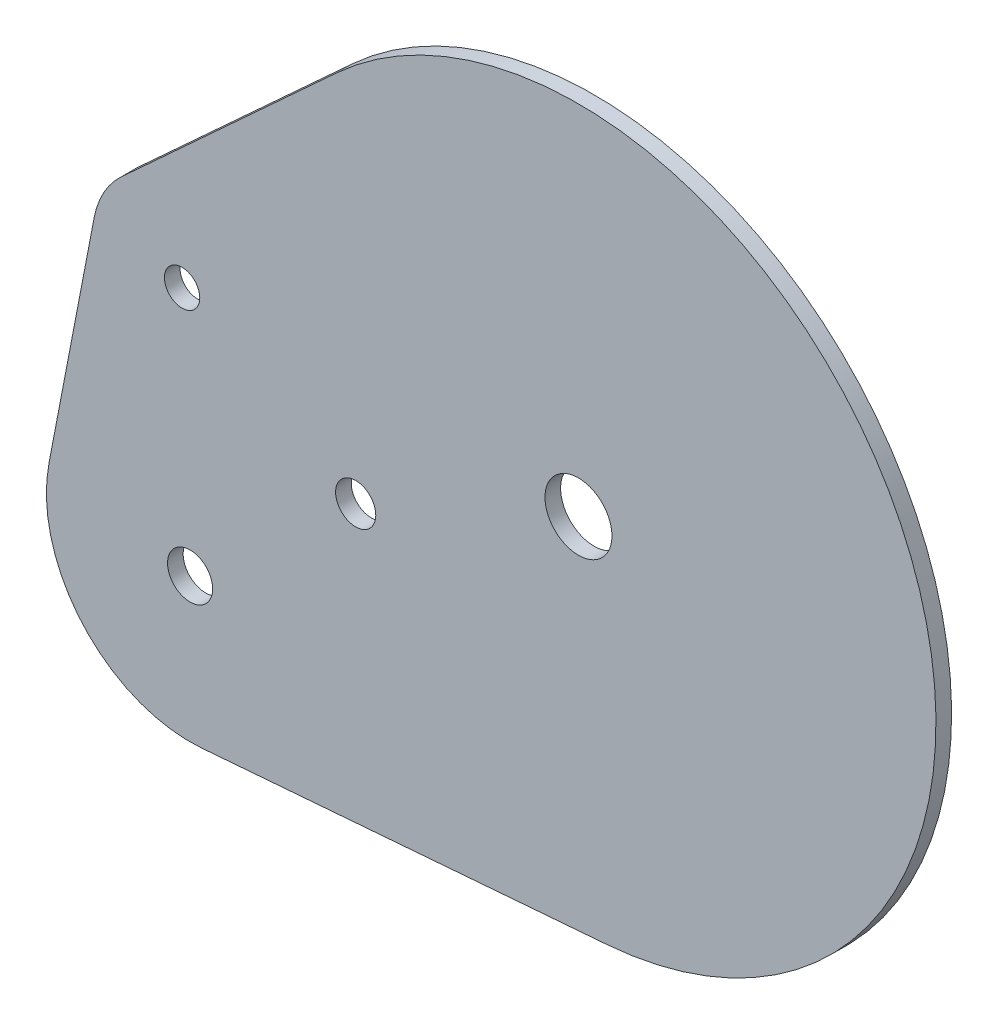
ISO-10303-21;
HEADER;
FILE_DESCRIPTION(('STEP AP214'),'2;1');
FILE_NAME('part.step','',(''),(''),'','','');
FILE_SCHEMA(('AUTOMOTIVE_DESIGN { 1 0 10303 214 1 1 1 1 }'));
ENDSEC;
DATA;
#1=APPLICATION_CONTEXT('core data for automotive mechanical design processes');
#2=APPLICATION_PROTOCOL_DEFINITION('international standard','automotive_design',2000,#1);
#3=PRODUCT_CONTEXT('',#1,'mechanical');
#4=PRODUCT('Part','Part','',(#3));
#5=PRODUCT_RELATED_PRODUCT_CATEGORY('part','',(#4));
#6=PRODUCT_DEFINITION_FORMATION('','',#4);
#7=PRODUCT_DEFINITION_CONTEXT('part definition',#1,'design');
#8=PRODUCT_DEFINITION('design','',#6,#7);
#9=PRODUCT_DEFINITION_SHAPE('','',#8);
#10=(LENGTH_UNIT() NAMED_UNIT(*) SI_UNIT(.MILLI.,.METRE.));
#11=(NAMED_UNIT(*) PLANE_ANGLE_UNIT() SI_UNIT($,.RADIAN.));
#12=(NAMED_UNIT(*) SI_UNIT($,.STERADIAN.) SOLID_ANGLE_UNIT());
#13=UNCERTAINTY_MEASURE_WITH_UNIT(LENGTH_MEASURE(1.E-05),#10,'distance_accuracy_value','');
#14=(GEOMETRIC_REPRESENTATION_CONTEXT(3) GLOBAL_UNCERTAINTY_ASSIGNED_CONTEXT((#13)) GLOBAL_UNIT_ASSIGNED_CONTEXT((#10,
#11,#12)) REPRESENTATION_CONTEXT('',''));
#15=CARTESIAN_POINT('',(0.,0.,0.));
#16=DIRECTION('',(0.,0.,1.));
#17=DIRECTION('',(1.,0.,0.));
#18=AXIS2_PLACEMENT_3D('',#15,#16,#17);
#19=CARTESIAN_POINT('',(-1.60982338570648E-12,1.8327353523695E-12,4.445));
#20=DIRECTION('',(0.,0.,-1.));
#21=DIRECTION('',(-1.,0.,0.));
#22=AXIS2_PLACEMENT_3D('',#19,#20,#21);
#23=CYLINDRICAL_SURFACE('',#22,25.4524678909989);
#24=DIRECTION('',(0.,0.,-1.));
#25=VECTOR('',#24,1.);
#26=CARTESIAN_POINT('',(-24.9953882674721,4.8019461784516,201.32048336804));
#27=LINE('',#26,#25);
#28=CARTESIAN_POINT('',(-24.9953882674721,4.8019461784516,4.445));
#29=VERTEX_POINT('',#28);
#30=CARTESIAN_POINT('',(-24.9953882674721,4.8019461784516,0.));
#31=VERTEX_POINT('',#30);
#32=EDGE_CURVE('E218',#29,#31,#27,.T.);
#33=ORIENTED_EDGE('',*,*,#32,.F.);
#34=CARTESIAN_POINT('',(-1.60982338570648E-12,1.8327353523695E-12,4.445));
#35=DIRECTION('',(0.,0.,1.));
#36=DIRECTION('',(1.,0.,0.));
#37=AXIS2_PLACEMENT_3D('',#34,#35,#36);
#38=CIRCLE('',#37,25.4524678909989);
#39=CARTESIAN_POINT('',(-17.2110159448165,18.7512413426328,4.445));
#40=VERTEX_POINT('',#39);
#41=EDGE_CURVE('E167',#40,#29,#38,.T.);
#42=ORIENTED_EDGE('',*,*,#41,.F.);
#43=DIRECTION('',(0.,0.,-1.));
#44=VECTOR('',#43,1.);
#45=CARTESIAN_POINT('',(-17.2110159448165,18.7512413426328,4.445));
#46=LINE('',#45,#44);
#47=CARTESIAN_POINT('',(-17.2110159448165,18.7512413426328,0.));
#48=VERTEX_POINT('',#47);
#49=EDGE_CURVE('E42',#40,#48,#46,.T.);
#50=ORIENTED_EDGE('',*,*,#49,.T.);
#51=CARTESIAN_POINT('',(-1.60982338570648E-12,1.8327353523695E-12,0.));
#52=DIRECTION('',(0.,0.,1.));
#53=DIRECTION('',(1.,0.,0.));
#54=AXIS2_PLACEMENT_3D('',#51,#52,#53);
#55=CIRCLE('',#54,25.4524678909989);
#56=EDGE_CURVE('E172',#48,#31,#55,.T.);
#57=ORIENTED_EDGE('',*,*,#56,.T.);
#58=EDGE_LOOP('',(#33,#42,#50,#57));
#59=FACE_BOUND('',#58,.T.);
#60=ADVANCED_FACE('F35',(#59),#23,.T.);
#61=CARTESIAN_POINT('',(-1.60982338570648E-12,1.8327353523695E-12,4.445));
#62=DIRECTION('',(0.,0.,1.));
#63=DIRECTION('',(1.,0.,0.));
#64=AXIS2_PLACEMENT_3D('',#61,#62,#63);
#65=PLANE('',#64);
#66=ORIENTED_EDGE('',*,*,#41,.T.);
#67=DIRECTION('',(-0.188663284009011,-0.982041834784514,0.));
#68=VECTOR('',#67,1.);
#69=CARTESIAN_POINT('',(-24.9953882674721,4.8019461784516,4.445));
#70=LINE('',#69,#68);
#71=CARTESIAN_POINT('',(-37.8559058277664,-62.1404179785651,4.445));
#72=VERTEX_POINT('',#71);
#73=EDGE_CURVE('E207',#29,#72,#70,.T.);
#74=ORIENTED_EDGE('',*,*,#73,.T.);
#75=CARTESIAN_POINT('',(2.27448898392381,-69.85,4.445));
#76=DIRECTION('',(0.,0.,1.));
#77=DIRECTION('',(1.,0.,0.));
#78=AXIS2_PLACEMENT_3D('',#75,#76,#77);
#79=CIRCLE('',#78,40.864241614);
#80=CARTESIAN_POINT('',(5.53884195385694,-110.583650000645,4.445));
#81=VERTEX_POINT('',#80);
#82=EDGE_CURVE('E152',#72,#81,#79,.T.);
#83=ORIENTED_EDGE('',*,*,#82,.T.);
#84=DIRECTION('',(0.996804257017947,0.0798828716991234,0.));
#85=VECTOR('',#84,1.);
#86=CARTESIAN_POINT('',(5.53884195385696,-110.583650000645,4.445));
#87=LINE('',#86,#85);
#88=CARTESIAN_POINT('',(120.83410477307,-101.344005785183,4.445));
#89=VERTEX_POINT('',#88);
#90=EDGE_CURVE('E57',#81,#89,#87,.T.);
#91=ORIENTED_EDGE('',*,*,#90,.T.);
#92=CARTESIAN_POINT('',(112.7125,0.,4.445));
#93=DIRECTION('',(0.,0.,1.));
#94=DIRECTION('',(1.,0.,0.));
#95=AXIS2_PLACEMENT_3D('',#92,#93,#94);
#96=CIRCLE('',#95,101.668913502);
#97=CARTESIAN_POINT('',(43.9637523787988,74.901119305345,4.445));
#98=VERTEX_POINT('',#97);
#99=EDGE_CURVE('E163',#89,#98,#96,.T.);
#100=ORIENTED_EDGE('',*,*,#99,.T.);
#101=DIRECTION('',(-0.736716039597213,-0.676202245633803,0.));
#102=VECTOR('',#101,1.);
#103=CARTESIAN_POINT('',(-17.2110159448165,18.7512413426328,4.445));
#104=LINE('',#103,#102);
#105=EDGE_CURVE('E166',#98,#40,#104,.T.);
#106=ORIENTED_EDGE('',*,*,#105,.T.);
#107=EDGE_LOOP('',(#66,#74,#83,#91,#100,#106));
#108=FACE_BOUND('',#107,.T.);
#109=CARTESIAN_POINT('',(112.7125,0.,4.445));
#110=DIRECTION('',(0.,0.,1.));
#111=DIRECTION('',(1.,0.,0.));
#112=AXIS2_PLACEMENT_3D('',#109,#110,#111);
#113=CIRCLE('',#112,9.52500000000001);
#114=CARTESIAN_POINT('',(122.2375,0.,4.445));
#115=VERTEX_POINT('',#114);
#116=EDGE_CURVE('E236',#115,#115,#113,.T.);
#117=ORIENTED_EDGE('',*,*,#116,.F.);
#118=EDGE_LOOP('',(#117));
#119=FACE_BOUND('',#118,.T.);
#120=CARTESIAN_POINT('',(-1.60982338570648E-12,1.8327353523695E-12,4.445));
#121=DIRECTION('',(0.,0.,1.));
#122=DIRECTION('',(1.,0.,0.));
#123=AXIS2_PLACEMENT_3D('',#120,#121,#122);
#124=CIRCLE('',#123,5.02539999999999);
#125=CARTESIAN_POINT('',(5.02539999999838,1.8327353523695E-12,4.445));
#126=VERTEX_POINT('',#125);
#127=EDGE_CURVE('E176',#126,#126,#124,.T.);
#128=ORIENTED_EDGE('',*,*,#127,.F.);
#129=EDGE_LOOP('',(#128));
#130=FACE_BOUND('',#129,.T.);
#131=CARTESIAN_POINT('',(49.3634480157114,-28.4999999999982,4.445));
#132=DIRECTION('',(0.,0.,1.));
#133=DIRECTION('',(1.,0.,0.));
#134=AXIS2_PLACEMENT_3D('',#131,#132,#133);
#135=CIRCLE('',#134,5.715);
#136=CARTESIAN_POINT('',(55.0784480157114,-28.4999999999982,4.445));
#137=VERTEX_POINT('',#136);
#138=EDGE_CURVE('E223',#137,#137,#135,.T.);
#139=ORIENTED_EDGE('',*,*,#138,.F.);
#140=EDGE_LOOP('',(#139));
#141=FACE_BOUND('',#140,.T.);
#142=CARTESIAN_POINT('',(2.27448898392381,-69.85,4.445));
#143=DIRECTION('',(0.,0.,1.));
#144=DIRECTION('',(1.,0.,0.));
#145=AXIS2_PLACEMENT_3D('',#142,#143,#144);
#146=CIRCLE('',#145,6.41350000000001);
#147=CARTESIAN_POINT('',(8.68798898392382,-69.85,4.445));
#148=VERTEX_POINT('',#147);
#149=EDGE_CURVE('E146',#148,#148,#146,.T.);
#150=ORIENTED_EDGE('',*,*,#149,.F.);
#151=EDGE_LOOP('',(#150));
#152=FACE_BOUND('',#151,.T.);
#153=ADVANCED_FACE('F262',(#108,#119,#130,#141,#152),#65,.T.);
#154=CARTESIAN_POINT('',(-1.60982338570648E-12,1.8327353523695E-12,0.));
#155=DIRECTION('',(0.,0.,1.));
#156=DIRECTION('',(1.,0.,0.));
#157=AXIS2_PLACEMENT_3D('',#154,#155,#156);
#158=PLANE('',#157);
#159=DIRECTION('',(-1.,0.,0.));
#160=VECTOR('',#159,1.);
#161=CARTESIAN_POINT('',(102.007029071081,43.889088001976,0.));
#162=LINE('',#161,#160);
#163=CARTESIAN_POINT('',(102.007029071081,43.889088001976,0.));
#164=VERTEX_POINT('',#163);
#165=CARTESIAN_POINT('',(88.5040973105047,43.889088001976,0.));
#166=VERTEX_POINT('',#165);
#167=EDGE_CURVE('E140',#164,#166,#162,.T.);
#168=ORIENTED_EDGE('',*,*,#167,.F.);
#169=DIRECTION('',(0.,-1.,0.));
#170=VECTOR('',#169,1.);
#171=CARTESIAN_POINT('',(102.007029071081,50.1084351119226,0.));
#172=LINE('',#171,#170);
#173=CARTESIAN_POINT('',(102.007029071081,50.1084351119226,0.));
#174=VERTEX_POINT('',#173);
#175=EDGE_CURVE('E49',#174,#164,#172,.T.);
#176=ORIENTED_EDGE('',*,*,#175,.F.);
#177=DIRECTION('',(1.,0.,0.));
#178=VECTOR('',#177,1.);
#179=CARTESIAN_POINT('',(102.007029071081,50.1084351119226,0.));
#180=LINE('',#179,#178);
#181=CARTESIAN_POINT('',(88.5040973105047,50.1084351119226,0.));
#182=VERTEX_POINT('',#181);
#183=EDGE_CURVE('E131',#182,#174,#180,.T.);
#184=ORIENTED_EDGE('',*,*,#183,.F.);
#185=DIRECTION('',(0.,1.,0.));
#186=VECTOR('',#185,1.);
#187=CARTESIAN_POINT('',(88.5040973105047,50.1084351119226,0.));
#188=LINE('',#187,#186);
#189=EDGE_CURVE('E134',#166,#182,#188,.T.);
#190=ORIENTED_EDGE('',*,*,#189,.F.);
#191=EDGE_LOOP('',(#168,#176,#184,#190));
#192=FACE_BOUND('',#191,.T.);
#193=DIRECTION('',(-0.188663284009011,-0.982041834784514,0.));
#194=VECTOR('',#193,1.);
#195=CARTESIAN_POINT('',(-24.9953882674721,4.8019461784516,0.));
#196=LINE('',#195,#194);
#197=CARTESIAN_POINT('',(-37.8559058277664,-62.1404179785651,0.));
#198=VERTEX_POINT('',#197);
#199=EDGE_CURVE('E196',#31,#198,#196,.T.);
#200=ORIENTED_EDGE('',*,*,#199,.F.);
#201=ORIENTED_EDGE('',*,*,#56,.F.);
#202=DIRECTION('',(-0.736716039597213,-0.676202245633803,0.));
#203=VECTOR('',#202,1.);
#204=CARTESIAN_POINT('',(-17.2110159448165,18.7512413426328,0.));
#205=LINE('',#204,#203);
#206=CARTESIAN_POINT('',(43.9637523787988,74.901119305345,0.));
#207=VERTEX_POINT('',#206);
#208=EDGE_CURVE('E178',#207,#48,#205,.T.);
#209=ORIENTED_EDGE('',*,*,#208,.F.);
#210=CARTESIAN_POINT('',(112.7125,0.,0.));
#211=DIRECTION('',(0.,0.,1.));
#212=DIRECTION('',(1.,0.,0.));
#213=AXIS2_PLACEMENT_3D('',#210,#211,#212);
#214=CIRCLE('',#213,101.668913502);
#215=CARTESIAN_POINT('',(120.83410477307,-101.344005785183,0.));
#216=VERTEX_POINT('',#215);
#217=EDGE_CURVE('E175',#216,#207,#214,.T.);
#218=ORIENTED_EDGE('',*,*,#217,.F.);
#219=DIRECTION('',(0.996804257017947,0.0798828716991234,0.));
#220=VECTOR('',#219,1.);
#221=CARTESIAN_POINT('',(5.53884195385696,-110.583650000645,0.));
#222=LINE('',#221,#220);
#223=CARTESIAN_POINT('',(5.53884195385694,-110.583650000645,0.));
#224=VERTEX_POINT('',#223);
#225=EDGE_CURVE('E204',#224,#216,#222,.T.);
#226=ORIENTED_EDGE('',*,*,#225,.F.);
#227=CARTESIAN_POINT('',(2.27448898392381,-69.85,0.));
#228=DIRECTION('',(0.,0.,1.));
#229=DIRECTION('',(1.,0.,0.));
#230=AXIS2_PLACEMENT_3D('',#227,#228,#229);
#231=CIRCLE('',#230,40.864241614);
#232=EDGE_CURVE('E199',#198,#224,#231,.T.);
#233=ORIENTED_EDGE('',*,*,#232,.F.);
#234=EDGE_LOOP('',(#200,#201,#209,#218,#226,#233));
#235=FACE_BOUND('',#234,.T.);
#236=CARTESIAN_POINT('',(112.7125,0.,0.));
#237=DIRECTION('',(0.,0.,1.));
#238=DIRECTION('',(1.,0.,0.));
#239=AXIS2_PLACEMENT_3D('',#236,#237,#238);
#240=CIRCLE('',#239,9.52500000000001);
#241=CARTESIAN_POINT('',(122.2375,0.,0.));
#242=VERTEX_POINT('',#241);
#243=EDGE_CURVE('E227',#242,#242,#240,.T.);
#244=ORIENTED_EDGE('',*,*,#243,.T.);
#245=EDGE_LOOP('',(#244));
#246=FACE_BOUND('',#245,.T.);
#247=CARTESIAN_POINT('',(-1.60982338570648E-12,1.8327353523695E-12,0.));
#248=DIRECTION('',(0.,0.,1.));
#249=DIRECTION('',(1.,0.,0.));
#250=AXIS2_PLACEMENT_3D('',#247,#248,#249);
#251=CIRCLE('',#250,5.02539999999999);
#252=CARTESIAN_POINT('',(5.02539999999838,1.8327353523695E-12,0.));
#253=VERTEX_POINT('',#252);
#254=EDGE_CURVE('E234',#253,#253,#251,.T.);
#255=ORIENTED_EDGE('',*,*,#254,.T.);
#256=EDGE_LOOP('',(#255));
#257=FACE_BOUND('',#256,.T.);
#258=CARTESIAN_POINT('',(49.3634480157114,-28.4999999999982,0.));
#259=DIRECTION('',(0.,0.,1.));
#260=DIRECTION('',(1.,0.,0.));
#261=AXIS2_PLACEMENT_3D('',#258,#259,#260);
#262=CIRCLE('',#261,5.715);
#263=CARTESIAN_POINT('',(55.0784480157114,-28.4999999999982,0.));
#264=VERTEX_POINT('',#263);
#265=EDGE_CURVE('E219',#264,#264,#262,.T.);
#266=ORIENTED_EDGE('',*,*,#265,.T.);
#267=EDGE_LOOP('',(#266));
#268=FACE_BOUND('',#267,.T.);
#269=CARTESIAN_POINT('',(2.27448898392381,-69.85,0.));
#270=DIRECTION('',(0.,0.,1.));
#271=DIRECTION('',(1.,0.,0.));
#272=AXIS2_PLACEMENT_3D('',#269,#270,#271);
#273=CIRCLE('',#272,6.41350000000001);
#274=CARTESIAN_POINT('',(8.68798898392382,-69.85,0.));
#275=VERTEX_POINT('',#274);
#276=EDGE_CURVE('E202',#275,#275,#273,.T.);
#277=ORIENTED_EDGE('',*,*,#276,.T.);
#278=EDGE_LOOP('',(#277));
#279=FACE_BOUND('',#278,.T.);
#280=ADVANCED_FACE('F191',(#192,#235,#246,#257,#268,#279),#158,.F.);
#281=CARTESIAN_POINT('',(112.7125,0.,4.445));
#282=DIRECTION('',(0.,0.,-1.));
#283=DIRECTION('',(-1.,0.,0.));
#284=AXIS2_PLACEMENT_3D('',#281,#282,#283);
#285=CYLINDRICAL_SURFACE('',#284,101.668913502);
#286=ORIENTED_EDGE('',*,*,#99,.F.);
#287=DIRECTION('',(0.,0.,-1.));
#288=VECTOR('',#287,1.);
#289=CARTESIAN_POINT('',(120.83410477307,-101.344005785183,201.32048336804));
#290=LINE('',#289,#288);
#291=EDGE_CURVE('E211',#89,#216,#290,.T.);
#292=ORIENTED_EDGE('',*,*,#291,.T.);
#293=ORIENTED_EDGE('',*,*,#217,.T.);
#294=DIRECTION('',(0.,0.,-1.));
#295=VECTOR('',#294,1.);
#296=CARTESIAN_POINT('',(43.9637523787988,74.901119305345,4.445));
#297=LINE('',#296,#295);
#298=EDGE_CURVE('E12',#98,#207,#297,.T.);
#299=ORIENTED_EDGE('',*,*,#298,.F.);
#300=EDGE_LOOP('',(#286,#292,#293,#299));
#301=FACE_BOUND('',#300,.T.);
#302=ADVANCED_FACE('F270',(#301),#285,.T.);
#303=CARTESIAN_POINT('',(-17.2110159448165,18.7512413426328,4.445));
#304=DIRECTION('',(0.676202245633803,-0.736716039597213,0.));
#305=DIRECTION('',(0.736716039597213,0.676202245633803,0.));
#306=AXIS2_PLACEMENT_3D('',#303,#304,#305);
#307=PLANE('',#306);
#308=ORIENTED_EDGE('',*,*,#208,.T.);
#309=ORIENTED_EDGE('',*,*,#49,.F.);
#310=ORIENTED_EDGE('',*,*,#105,.F.);
#311=ORIENTED_EDGE('',*,*,#298,.T.);
#312=EDGE_LOOP('',(#308,#309,#310,#311));
#313=FACE_BOUND('',#312,.T.);
#314=ADVANCED_FACE('F258',(#313),#307,.F.);
#315=CARTESIAN_POINT('',(-1.60982338570648E-12,1.8327353523695E-12,4.445));
#316=DIRECTION('',(0.,0.,-1.));
#317=DIRECTION('',(-1.,0.,0.));
#318=AXIS2_PLACEMENT_3D('',#315,#316,#317);
#319=CYLINDRICAL_SURFACE('',#318,5.02539999999999);
#320=ORIENTED_EDGE('',*,*,#127,.T.);
#321=EDGE_LOOP('',(#320));
#322=FACE_BOUND('',#321,.T.);
#323=ORIENTED_EDGE('',*,*,#254,.F.);
#324=EDGE_LOOP('',(#323));
#325=FACE_BOUND('',#324,.T.);
#326=ADVANCED_FACE('F249',(#322,#325),#319,.F.);
#327=CARTESIAN_POINT('',(112.7125,0.,4.445));
#328=DIRECTION('',(0.,0.,-1.));
#329=DIRECTION('',(-1.,0.,0.));
#330=AXIS2_PLACEMENT_3D('',#327,#328,#329);
#331=CYLINDRICAL_SURFACE('',#330,9.52500000000001);
#332=ORIENTED_EDGE('',*,*,#116,.T.);
#333=EDGE_LOOP('',(#332));
#334=FACE_BOUND('',#333,.T.);
#335=ORIENTED_EDGE('',*,*,#243,.F.);
#336=EDGE_LOOP('',(#335));
#337=FACE_BOUND('',#336,.T.);
#338=ADVANCED_FACE('F246',(#334,#337),#331,.F.);
#339=CARTESIAN_POINT('',(49.3634480157114,-28.4999999999982,4.445));
#340=DIRECTION('',(0.,0.,-1.));
#341=DIRECTION('',(-1.,0.,0.));
#342=AXIS2_PLACEMENT_3D('',#339,#340,#341);
#343=CYLINDRICAL_SURFACE('',#342,5.715);
#344=ORIENTED_EDGE('',*,*,#138,.T.);
#345=EDGE_LOOP('',(#344));
#346=FACE_BOUND('',#345,.T.);
#347=ORIENTED_EDGE('',*,*,#265,.F.);
#348=EDGE_LOOP('',(#347));
#349=FACE_BOUND('',#348,.T.);
#350=ADVANCED_FACE('F248',(#346,#349),#343,.F.);
#351=CARTESIAN_POINT('',(5.53884195385696,-110.583650000645,201.32048336804));
#352=DIRECTION('',(-0.0798828716991234,0.996804257017947,0.));
#353=DIRECTION('',(-0.996804257017947,-0.0798828716991234,0.));
#354=AXIS2_PLACEMENT_3D('',#351,#352,#353);
#355=PLANE('',#354);
#356=ORIENTED_EDGE('',*,*,#90,.F.);
#357=DIRECTION('',(0.,0.,-1.));
#358=VECTOR('',#357,1.);
#359=CARTESIAN_POINT('',(5.53884195385694,-110.583650000645,201.32048336804));
#360=LINE('',#359,#358);
#361=EDGE_CURVE('E214',#81,#224,#360,.T.);
#362=ORIENTED_EDGE('',*,*,#361,.T.);
#363=ORIENTED_EDGE('',*,*,#225,.T.);
#364=ORIENTED_EDGE('',*,*,#291,.F.);
#365=EDGE_LOOP('',(#356,#362,#363,#364));
#366=FACE_BOUND('',#365,.T.);
#367=ADVANCED_FACE('F255',(#366),#355,.F.);
#368=CARTESIAN_POINT('',(2.27448898392381,-69.85,201.32048336804));
#369=DIRECTION('',(0.,0.,-1.));
#370=DIRECTION('',(-1.,0.,0.));
#371=AXIS2_PLACEMENT_3D('',#368,#369,#370);
#372=CYLINDRICAL_SURFACE('',#371,40.864241614);
#373=ORIENTED_EDGE('',*,*,#82,.F.);
#374=DIRECTION('',(0.,0.,-1.));
#375=VECTOR('',#374,1.);
#376=CARTESIAN_POINT('',(-37.8559058277664,-62.1404179785651,201.32048336804));
#377=LINE('',#376,#375);
#378=EDGE_CURVE('E216',#72,#198,#377,.T.);
#379=ORIENTED_EDGE('',*,*,#378,.T.);
#380=ORIENTED_EDGE('',*,*,#232,.T.);
#381=ORIENTED_EDGE('',*,*,#361,.F.);
#382=EDGE_LOOP('',(#373,#379,#380,#381));
#383=FACE_BOUND('',#382,.T.);
#384=ADVANCED_FACE('F287',(#383),#372,.T.);
#385=CARTESIAN_POINT('',(-24.9953882674721,4.8019461784516,201.32048336804));
#386=DIRECTION('',(0.982041834784514,-0.188663284009011,0.));
#387=DIRECTION('',(0.188663284009011,0.982041834784514,0.));
#388=AXIS2_PLACEMENT_3D('',#385,#386,#387);
#389=PLANE('',#388);
#390=ORIENTED_EDGE('',*,*,#73,.F.);
#391=ORIENTED_EDGE('',*,*,#32,.T.);
#392=ORIENTED_EDGE('',*,*,#199,.T.);
#393=ORIENTED_EDGE('',*,*,#378,.F.);
#394=EDGE_LOOP('',(#390,#391,#392,#393));
#395=FACE_BOUND('',#394,.T.);
#396=ADVANCED_FACE('F285',(#395),#389,.F.);
#397=CARTESIAN_POINT('',(2.27448898392381,-69.85,201.32048336804));
#398=DIRECTION('',(0.,0.,-1.));
#399=DIRECTION('',(-1.,0.,0.));
#400=AXIS2_PLACEMENT_3D('',#397,#398,#399);
#401=CYLINDRICAL_SURFACE('',#400,6.41350000000001);
#402=ORIENTED_EDGE('',*,*,#276,.F.);
#403=EDGE_LOOP('',(#402));
#404=FACE_BOUND('',#403,.T.);
#405=ORIENTED_EDGE('',*,*,#149,.T.);
#406=EDGE_LOOP('',(#405));
#407=FACE_BOUND('',#406,.T.);
#408=ADVANCED_FACE('F297',(#404,#407),#401,.F.);
#409=CARTESIAN_POINT('',(102.007029071081,50.1084351119226,2.54));
#410=DIRECTION('',(1.,0.,0.));
#411=DIRECTION('',(0.,0.,-1.));
#412=AXIS2_PLACEMENT_3D('',#409,#410,#411);
#413=PLANE('',#412);
#414=ORIENTED_EDGE('',*,*,#175,.T.);
#415=DIRECTION('',(0.,0.,-1.));
#416=VECTOR('',#415,1.);
#417=CARTESIAN_POINT('',(102.007029071081,43.889088001976,2.54));
#418=LINE('',#417,#416);
#419=CARTESIAN_POINT('',(102.007029071081,43.889088001976,2.54));
#420=VERTEX_POINT('',#419);
#421=EDGE_CURVE('E109',#420,#164,#418,.T.);
#422=ORIENTED_EDGE('',*,*,#421,.F.);
#423=DIRECTION('',(0.,-1.,0.));
#424=VECTOR('',#423,1.);
#425=CARTESIAN_POINT('',(102.007029071081,50.1084351119226,2.54));
#426=LINE('',#425,#424);
#427=CARTESIAN_POINT('',(102.007029071081,50.1084351119226,2.54));
#428=VERTEX_POINT('',#427);
#429=EDGE_CURVE('E113',#428,#420,#426,.T.);
#430=ORIENTED_EDGE('',*,*,#429,.F.);
#431=DIRECTION('',(0.,0.,-1.));
#432=VECTOR('',#431,1.);
#433=CARTESIAN_POINT('',(102.007029071081,50.1084351119226,2.54));
#434=LINE('',#433,#432);
#435=EDGE_CURVE('E144',#428,#174,#434,.T.);
#436=ORIENTED_EDGE('',*,*,#435,.T.);
#437=EDGE_LOOP('',(#414,#422,#430,#436));
#438=FACE_BOUND('',#437,.T.);
#439=ADVANCED_FACE('F111',(#438),#413,.F.);
#440=CARTESIAN_POINT('',(102.007029071081,50.1084351119226,2.54));
#441=DIRECTION('',(0.,1.,0.));
#442=DIRECTION('',(0.,0.,1.));
#443=AXIS2_PLACEMENT_3D('',#440,#441,#442);
#444=PLANE('',#443);
#445=ORIENTED_EDGE('',*,*,#183,.T.);
#446=ORIENTED_EDGE('',*,*,#435,.F.);
#447=DIRECTION('',(1.,0.,0.));
#448=VECTOR('',#447,1.);
#449=CARTESIAN_POINT('',(102.007029071081,50.1084351119226,2.54));
#450=LINE('',#449,#448);
#451=CARTESIAN_POINT('',(88.5040973105047,50.1084351119226,2.54));
#452=VERTEX_POINT('',#451);
#453=EDGE_CURVE('E119',#452,#428,#450,.T.);
#454=ORIENTED_EDGE('',*,*,#453,.F.);
#455=DIRECTION('',(0.,0.,-1.));
#456=VECTOR('',#455,1.);
#457=CARTESIAN_POINT('',(88.5040973105047,50.1084351119226,2.54));
#458=LINE('',#457,#456);
#459=EDGE_CURVE('E147',#452,#182,#458,.T.);
#460=ORIENTED_EDGE('',*,*,#459,.T.);
#461=EDGE_LOOP('',(#445,#446,#454,#460));
#462=FACE_BOUND('',#461,.T.);
#463=ADVANCED_FACE('F308',(#462),#444,.F.);
#464=CARTESIAN_POINT('',(88.5040973105047,50.1084351119226,2.54));
#465=DIRECTION('',(-1.,0.,0.));
#466=DIRECTION('',(0.,0.,1.));
#467=AXIS2_PLACEMENT_3D('',#464,#465,#466);
#468=PLANE('',#467);
#469=ORIENTED_EDGE('',*,*,#189,.T.);
#470=ORIENTED_EDGE('',*,*,#459,.F.);
#471=DIRECTION('',(0.,1.,0.));
#472=VECTOR('',#471,1.);
#473=CARTESIAN_POINT('',(88.5040973105047,50.1084351119226,2.54));
#474=LINE('',#473,#472);
#475=CARTESIAN_POINT('',(88.5040973105047,43.889088001976,2.54));
#476=VERTEX_POINT('',#475);
#477=EDGE_CURVE('E127',#476,#452,#474,.T.);
#478=ORIENTED_EDGE('',*,*,#477,.F.);
#479=DIRECTION('',(0.,0.,-1.));
#480=VECTOR('',#479,1.);
#481=CARTESIAN_POINT('',(88.5040973105047,43.889088001976,2.54));
#482=LINE('',#481,#480);
#483=EDGE_CURVE('E118',#476,#166,#482,.T.);
#484=ORIENTED_EDGE('',*,*,#483,.T.);
#485=EDGE_LOOP('',(#469,#470,#478,#484));
#486=FACE_BOUND('',#485,.T.);
#487=ADVANCED_FACE('F317',(#486),#468,.F.);
#488=CARTESIAN_POINT('',(102.007029071081,43.889088001976,2.54));
#489=DIRECTION('',(0.,-1.,0.));
#490=DIRECTION('',(0.,0.,-1.));
#491=AXIS2_PLACEMENT_3D('',#488,#489,#490);
#492=PLANE('',#491);
#493=ORIENTED_EDGE('',*,*,#167,.T.);
#494=ORIENTED_EDGE('',*,*,#483,.F.);
#495=DIRECTION('',(-1.,0.,0.));
#496=VECTOR('',#495,1.);
#497=CARTESIAN_POINT('',(102.007029071081,43.889088001976,2.54));
#498=LINE('',#497,#496);
#499=EDGE_CURVE('E122',#420,#476,#498,.T.);
#500=ORIENTED_EDGE('',*,*,#499,.F.);
#501=ORIENTED_EDGE('',*,*,#421,.T.);
#502=EDGE_LOOP('',(#493,#494,#500,#501));
#503=FACE_BOUND('',#502,.T.);
#504=ADVANCED_FACE('F123',(#503),#492,.F.);
#505=CARTESIAN_POINT('',(0.,0.,2.54));
#506=DIRECTION('',(0.,0.,-1.));
#507=DIRECTION('',(-1.,0.,0.));
#508=AXIS2_PLACEMENT_3D('',#505,#506,#507);
#509=PLANE('',#508);
#510=ORIENTED_EDGE('',*,*,#429,.T.);
#511=ORIENTED_EDGE('',*,*,#499,.T.);
#512=ORIENTED_EDGE('',*,*,#477,.T.);
#513=ORIENTED_EDGE('',*,*,#453,.T.);
#514=EDGE_LOOP('',(#510,#511,#512,#513));
#515=FACE_BOUND('',#514,.T.);
#516=ADVANCED_FACE('F129',(#515),#509,.T.);
#517=CLOSED_SHELL('',(#60,#153,#280,#302,#314,#326,#338,#350,#367,#384,#396,#408,#439,#463,#487,
#504,#516));
#518=MANIFOLD_SOLID_BREP('B2',#517);
#519=ADVANCED_BREP_SHAPE_REPRESENTATION('',(#18,#518),#14);
#520=SHAPE_DEFINITION_REPRESENTATION(#9,#519);
ENDSEC;
END-ISO-10303-21;
